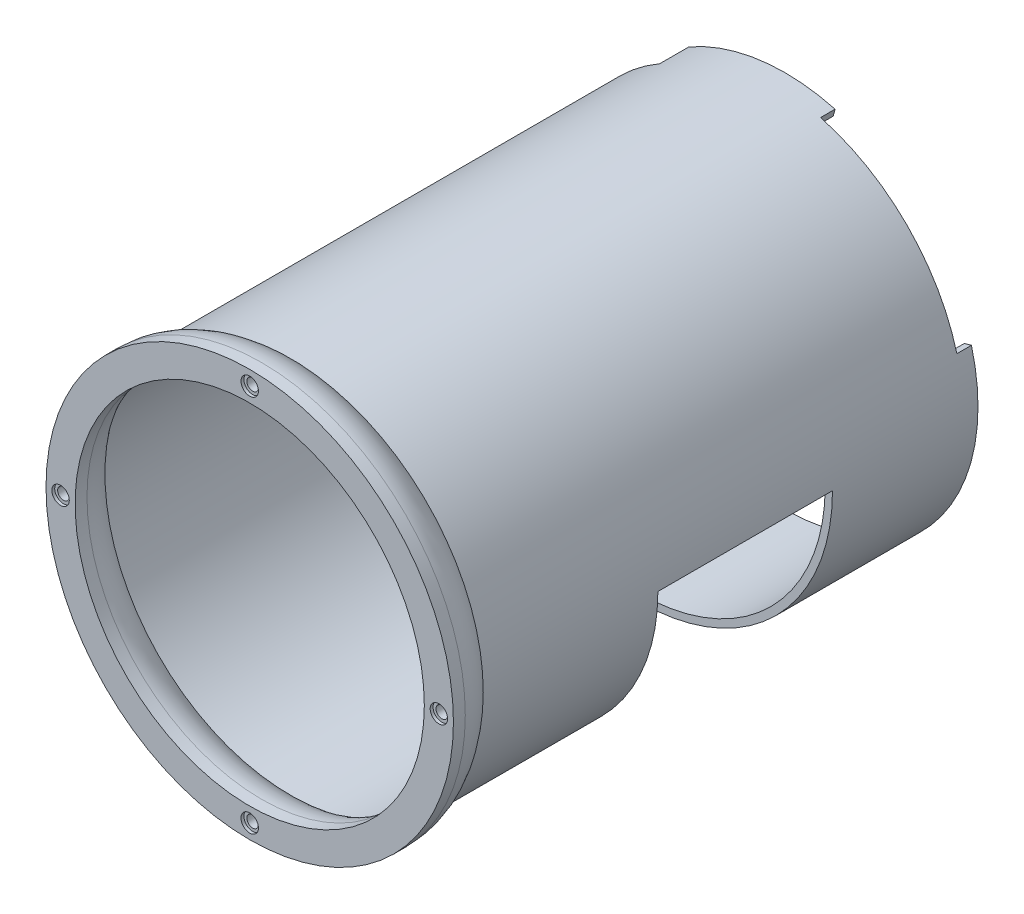
ISO-10303-21;
HEADER;
FILE_DESCRIPTION(('STEP AP214'),'2;1');
FILE_NAME('part.step','',(''),(''),'','','');
FILE_SCHEMA(('AUTOMOTIVE_DESIGN { 1 0 10303 214 1 1 1 1 }'));
ENDSEC;
DATA;
#1=APPLICATION_CONTEXT('core data for automotive mechanical design processes');
#2=APPLICATION_PROTOCOL_DEFINITION('international standard','automotive_design',2000,#1);
#3=PRODUCT_CONTEXT('',#1,'mechanical');
#4=PRODUCT('Part','Part','',(#3));
#5=PRODUCT_RELATED_PRODUCT_CATEGORY('part','',(#4));
#6=PRODUCT_DEFINITION_FORMATION('','',#4);
#7=PRODUCT_DEFINITION_CONTEXT('part definition',#1,'design');
#8=PRODUCT_DEFINITION('design','',#6,#7);
#9=PRODUCT_DEFINITION_SHAPE('','',#8);
#10=(LENGTH_UNIT() NAMED_UNIT(*) SI_UNIT(.MILLI.,.METRE.));
#11=(NAMED_UNIT(*) PLANE_ANGLE_UNIT() SI_UNIT($,.RADIAN.));
#12=(NAMED_UNIT(*) SI_UNIT($,.STERADIAN.) SOLID_ANGLE_UNIT());
#13=UNCERTAINTY_MEASURE_WITH_UNIT(LENGTH_MEASURE(1.E-05),#10,'distance_accuracy_value','');
#14=(GEOMETRIC_REPRESENTATION_CONTEXT(3) GLOBAL_UNCERTAINTY_ASSIGNED_CONTEXT((#13)) GLOBAL_UNIT_ASSIGNED_CONTEXT((#10,
#11,#12)) REPRESENTATION_CONTEXT('',''));
#15=CARTESIAN_POINT('',(0.,0.,0.));
#16=DIRECTION('',(0.,0.,1.));
#17=DIRECTION('',(1.,0.,0.));
#18=AXIS2_PLACEMENT_3D('',#15,#16,#17);
#19=CARTESIAN_POINT('',(0.,0.,-184.));
#20=DIRECTION('',(0.,0.,1.));
#21=DIRECTION('',(1.,0.,0.));
#22=AXIS2_PLACEMENT_3D('',#19,#20,#21);
#23=CYLINDRICAL_SURFACE('',#22,66.25);
#24=CARTESIAN_POINT('',(0.,0.,-74.));
#25=DIRECTION('',(0.,0.,1.));
#26=DIRECTION('',(1.,0.,0.));
#27=AXIS2_PLACEMENT_3D('',#24,#25,#26);
#28=CIRCLE('',#27,66.25);
#29=CARTESIAN_POINT('',(66.25,0.,-74.));
#30=VERTEX_POINT('',#29);
#31=CARTESIAN_POINT('',(0.,-66.25,-74.));
#32=VERTEX_POINT('',#31);
#33=EDGE_CURVE('E307',#30,#32,#28,.F.);
#34=ORIENTED_EDGE('',*,*,#33,.F.);
#35=DIRECTION('',(0.,0.,1.));
#36=VECTOR('',#35,1.);
#37=CARTESIAN_POINT('',(66.25,0.,-184.));
#38=LINE('',#37,#36);
#39=CARTESIAN_POINT('',(66.25,0.,-134.));
#40=VERTEX_POINT('',#39);
#41=EDGE_CURVE('E156',#30,#40,#38,.F.);
#42=ORIENTED_EDGE('',*,*,#41,.T.);
#43=CARTESIAN_POINT('',(0.,0.,-134.));
#44=DIRECTION('',(0.,0.,1.));
#45=DIRECTION('',(1.,0.,0.));
#46=AXIS2_PLACEMENT_3D('',#43,#44,#45);
#47=CIRCLE('',#46,66.25);
#48=CARTESIAN_POINT('',(0.,-66.25,-134.));
#49=VERTEX_POINT('',#48);
#50=EDGE_CURVE('E302',#40,#49,#47,.F.);
#51=ORIENTED_EDGE('',*,*,#50,.T.);
#52=DIRECTION('',(0.,0.,1.));
#53=VECTOR('',#52,1.);
#54=CARTESIAN_POINT('',(0.,-66.25,-184.));
#55=LINE('',#54,#53);
#56=EDGE_CURVE('E163',#49,#32,#55,.T.);
#57=ORIENTED_EDGE('',*,*,#56,.T.);
#58=EDGE_LOOP('',(#34,#42,#51,#57));
#59=FACE_BOUND('',#58,.T.);
#60=CARTESIAN_POINT('',(0.,0.,-14.));
#61=DIRECTION('',(0.,0.,1.));
#62=DIRECTION('',(1.,0.,0.));
#63=AXIS2_PLACEMENT_3D('',#60,#61,#62);
#64=CIRCLE('',#63,66.25);
#65=CARTESIAN_POINT('',(66.25,0.,-14.));
#66=VERTEX_POINT('',#65);
#67=EDGE_CURVE('E158',#66,#66,#64,.T.);
#68=ORIENTED_EDGE('',*,*,#67,.F.);
#69=EDGE_LOOP('',(#68));
#70=FACE_BOUND('',#69,.T.);
#71=CARTESIAN_POINT('',(0.,0.,-184.));
#72=DIRECTION('',(0.,0.,1.));
#73=DIRECTION('',(1.,0.,0.));
#74=AXIS2_PLACEMENT_3D('',#71,#72,#73);
#75=CIRCLE('',#74,66.25);
#76=CARTESIAN_POINT('',(-57.3741830007196,33.1249999999991,-184.));
#77=VERTEX_POINT('',#76);
#78=CARTESIAN_POINT('',(63.9925859916508,17.146761738042,-184.));
#79=VERTEX_POINT('',#78);
#80=EDGE_CURVE('E167',#77,#79,#75,.T.);
#81=ORIENTED_EDGE('',*,*,#80,.T.);
#82=DIRECTION('',(0.,0.,1.));
#83=VECTOR('',#82,1.);
#84=CARTESIAN_POINT('',(63.9925859916508,17.146761738042,-184.));
#85=LINE('',#84,#83);
#86=CARTESIAN_POINT('',(63.9925859916508,17.146761738042,-179.));
#87=VERTEX_POINT('',#86);
#88=EDGE_CURVE('E262',#79,#87,#85,.T.);
#89=ORIENTED_EDGE('',*,*,#88,.T.);
#90=CARTESIAN_POINT('',(0.,0.,-179.));
#91=DIRECTION('',(0.,0.,-1.));
#92=DIRECTION('',(-1.,0.,0.));
#93=AXIS2_PLACEMENT_3D('',#90,#91,#92);
#94=CIRCLE('',#93,66.25);
#95=CARTESIAN_POINT('',(17.146761738042,63.9925859916508,-179.));
#96=VERTEX_POINT('',#95);
#97=EDGE_CURVE('E283',#87,#96,#94,.F.);
#98=ORIENTED_EDGE('',*,*,#97,.T.);
#99=DIRECTION('',(0.,0.,1.));
#100=VECTOR('',#99,1.);
#101=CARTESIAN_POINT('',(17.146761738042,63.9925859916508,-184.));
#102=LINE('',#101,#100);
#103=CARTESIAN_POINT('',(17.146761738042,63.9925859916508,-184.));
#104=VERTEX_POINT('',#103);
#105=EDGE_CURVE('E139',#104,#96,#102,.T.);
#106=ORIENTED_EDGE('',*,*,#105,.F.);
#107=CARTESIAN_POINT('',(-33.1250000000003,57.3741830007189,-184.));
#108=VERTEX_POINT('',#107);
#109=EDGE_CURVE('E147',#104,#108,#75,.T.);
#110=ORIENTED_EDGE('',*,*,#109,.T.);
#111=DIRECTION('',(0.,0.,1.));
#112=VECTOR('',#111,1.);
#113=CARTESIAN_POINT('',(-33.1250000000003,57.3741830007189,-184.));
#114=LINE('',#113,#112);
#115=CARTESIAN_POINT('',(-33.1250000000003,57.3741830007189,-174.));
#116=VERTEX_POINT('',#115);
#117=EDGE_CURVE('E292',#108,#116,#114,.T.);
#118=ORIENTED_EDGE('',*,*,#117,.T.);
#119=CARTESIAN_POINT('',(0.,0.,-174.));
#120=DIRECTION('',(0.,0.,-1.));
#121=DIRECTION('',(-1.,0.,0.));
#122=AXIS2_PLACEMENT_3D('',#119,#120,#121);
#123=CIRCLE('',#122,66.25);
#124=CARTESIAN_POINT('',(-57.3741830007196,33.1249999999991,-174.));
#125=VERTEX_POINT('',#124);
#126=EDGE_CURVE('E289',#116,#125,#123,.F.);
#127=ORIENTED_EDGE('',*,*,#126,.T.);
#128=DIRECTION('',(0.,0.,1.));
#129=VECTOR('',#128,1.);
#130=CARTESIAN_POINT('',(-57.3741830007196,33.1249999999991,-184.));
#131=LINE('',#130,#129);
#132=EDGE_CURVE('E267',#125,#77,#131,.F.);
#133=ORIENTED_EDGE('',*,*,#132,.T.);
#134=EDGE_LOOP('',(#81,#89,#98,#106,#110,#118,#127,#133));
#135=FACE_BOUND('',#134,.T.);
#136=ADVANCED_FACE('F39',(#59,#70,#135),#23,.T.);
#137=CARTESIAN_POINT('',(0.,0.,-184.));
#138=DIRECTION('',(0.,0.,1.));
#139=DIRECTION('',(1.,0.,0.));
#140=AXIS2_PLACEMENT_3D('',#137,#138,#139);
#141=CYLINDRICAL_SURFACE('',#140,63.75);
#142=DIRECTION('',(0.,0.,1.));
#143=VECTOR('',#142,1.);
#144=CARTESIAN_POINT('',(63.75,0.,-184.));
#145=LINE('',#144,#143);
#146=CARTESIAN_POINT('',(63.75,0.,-74.));
#147=VERTEX_POINT('',#146);
#148=CARTESIAN_POINT('',(63.75,0.,-134.));
#149=VERTEX_POINT('',#148);
#150=EDGE_CURVE('E182',#147,#149,#145,.F.);
#151=ORIENTED_EDGE('',*,*,#150,.F.);
#152=CARTESIAN_POINT('',(0.,0.,-74.));
#153=DIRECTION('',(0.,0.,1.));
#154=DIRECTION('',(1.,0.,0.));
#155=AXIS2_PLACEMENT_3D('',#152,#153,#154);
#156=CIRCLE('',#155,63.75);
#157=CARTESIAN_POINT('',(0.,-63.75,-74.));
#158=VERTEX_POINT('',#157);
#159=EDGE_CURVE('E187',#147,#158,#156,.F.);
#160=ORIENTED_EDGE('',*,*,#159,.T.);
#161=DIRECTION('',(0.,0.,1.));
#162=VECTOR('',#161,1.);
#163=CARTESIAN_POINT('',(0.,-63.75,-184.));
#164=LINE('',#163,#162);
#165=CARTESIAN_POINT('',(0.,-63.75,-134.));
#166=VERTEX_POINT('',#165);
#167=EDGE_CURVE('E181',#166,#158,#164,.T.);
#168=ORIENTED_EDGE('',*,*,#167,.F.);
#169=CARTESIAN_POINT('',(0.,0.,-134.));
#170=DIRECTION('',(0.,0.,1.));
#171=DIRECTION('',(1.,0.,0.));
#172=AXIS2_PLACEMENT_3D('',#169,#170,#171);
#173=CIRCLE('',#172,63.75);
#174=EDGE_CURVE('E166',#149,#166,#173,.F.);
#175=ORIENTED_EDGE('',*,*,#174,.F.);
#176=EDGE_LOOP('',(#151,#160,#168,#175));
#177=FACE_BOUND('',#176,.T.);
#178=CARTESIAN_POINT('',(0.,0.,-14.));
#179=DIRECTION('',(0.,0.,1.));
#180=DIRECTION('',(1.,0.,0.));
#181=AXIS2_PLACEMENT_3D('',#178,#179,#180);
#182=CIRCLE('',#181,63.75);
#183=CARTESIAN_POINT('',(63.75,0.,-14.));
#184=VERTEX_POINT('',#183);
#185=EDGE_CURVE('E164',#184,#184,#182,.T.);
#186=ORIENTED_EDGE('',*,*,#185,.T.);
#187=EDGE_LOOP('',(#186));
#188=FACE_BOUND('',#187,.T.);
#189=DIRECTION('',(0.,0.,1.));
#190=VECTOR('',#189,1.);
#191=CARTESIAN_POINT('',(61.5777714259281,16.4997141252857,-184.));
#192=LINE('',#191,#190);
#193=CARTESIAN_POINT('',(61.5777714259281,16.4997141252857,-184.));
#194=VERTEX_POINT('',#193);
#195=CARTESIAN_POINT('',(61.5777714259281,16.4997141252857,-179.));
#196=VERTEX_POINT('',#195);
#197=EDGE_CURVE('E279',#194,#196,#192,.T.);
#198=ORIENTED_EDGE('',*,*,#197,.F.);
#199=CARTESIAN_POINT('',(0.,0.,-184.));
#200=DIRECTION('',(0.,0.,1.));
#201=DIRECTION('',(1.,0.,0.));
#202=AXIS2_PLACEMENT_3D('',#199,#200,#201);
#203=CIRCLE('',#202,63.75);
#204=CARTESIAN_POINT('',(-55.2091194912584,31.8749999999992,-184.));
#205=VERTEX_POINT('',#204);
#206=EDGE_CURVE('E152',#205,#194,#203,.T.);
#207=ORIENTED_EDGE('',*,*,#206,.F.);
#208=DIRECTION('',(0.,0.,1.));
#209=VECTOR('',#208,1.);
#210=CARTESIAN_POINT('',(-55.2091194912584,31.8749999999992,-184.));
#211=LINE('',#210,#209);
#212=CARTESIAN_POINT('',(-55.2091194912584,31.8749999999992,-174.));
#213=VERTEX_POINT('',#212);
#214=EDGE_CURVE('E195',#213,#205,#211,.F.);
#215=ORIENTED_EDGE('',*,*,#214,.F.);
#216=CARTESIAN_POINT('',(0.,0.,-174.));
#217=DIRECTION('',(0.,0.,-1.));
#218=DIRECTION('',(-1.,0.,0.));
#219=AXIS2_PLACEMENT_3D('',#216,#217,#218);
#220=CIRCLE('',#219,63.75);
#221=CARTESIAN_POINT('',(-31.8750000000004,55.2091194912577,-174.));
#222=VERTEX_POINT('',#221);
#223=EDGE_CURVE('E186',#222,#213,#220,.F.);
#224=ORIENTED_EDGE('',*,*,#223,.F.);
#225=DIRECTION('',(0.,0.,1.));
#226=VECTOR('',#225,1.);
#227=CARTESIAN_POINT('',(-31.8750000000004,55.2091194912577,-184.));
#228=LINE('',#227,#226);
#229=CARTESIAN_POINT('',(-31.8750000000004,55.2091194912577,-184.));
#230=VERTEX_POINT('',#229);
#231=EDGE_CURVE('E154',#230,#222,#228,.T.);
#232=ORIENTED_EDGE('',*,*,#231,.F.);
#233=CARTESIAN_POINT('',(16.4997141252857,61.5777714259281,-184.));
#234=VERTEX_POINT('',#233);
#235=EDGE_CURVE('E144',#234,#230,#203,.T.);
#236=ORIENTED_EDGE('',*,*,#235,.F.);
#237=DIRECTION('',(0.,0.,1.));
#238=VECTOR('',#237,1.);
#239=CARTESIAN_POINT('',(16.4997141252857,61.5777714259281,-184.));
#240=LINE('',#239,#238);
#241=CARTESIAN_POINT('',(16.4997141252857,61.5777714259281,-179.));
#242=VERTEX_POINT('',#241);
#243=EDGE_CURVE('E129',#234,#242,#240,.T.);
#244=ORIENTED_EDGE('',*,*,#243,.T.);
#245=CARTESIAN_POINT('',(0.,0.,-179.));
#246=DIRECTION('',(0.,0.,-1.));
#247=DIRECTION('',(-1.,0.,0.));
#248=AXIS2_PLACEMENT_3D('',#245,#246,#247);
#249=CIRCLE('',#248,63.75);
#250=EDGE_CURVE('E150',#196,#242,#249,.F.);
#251=ORIENTED_EDGE('',*,*,#250,.F.);
#252=EDGE_LOOP('',(#198,#207,#215,#224,#232,#236,#244,#251));
#253=FACE_BOUND('',#252,.T.);
#254=ADVANCED_FACE('F155',(#177,#188,#253),#141,.F.);
#255=CARTESIAN_POINT('',(0.,0.,-184.));
#256=DIRECTION('',(0.,0.,1.));
#257=DIRECTION('',(1.,0.,0.));
#258=AXIS2_PLACEMENT_3D('',#255,#256,#257);
#259=PLANE('',#258);
#260=DIRECTION('',(0.258819045102521,0.965925826289068,0.));
#261=VECTOR('',#260,1.);
#262=CARTESIAN_POINT('',(15.5291427061513,57.9555495773442,-184.));
#263=LINE('',#262,#261);
#264=EDGE_CURVE('E133',#234,#104,#263,.T.);
#265=ORIENTED_EDGE('',*,*,#264,.F.);
#266=ORIENTED_EDGE('',*,*,#235,.T.);
#267=DIRECTION('',(-0.499999999999934,0.866025403784477,0.));
#268=VECTOR('',#267,1.);
#269=CARTESIAN_POINT('',(-35.,60.6217782649107,-184.));
#270=LINE('',#269,#268);
#271=EDGE_CURVE('E286',#230,#108,#270,.T.);
#272=ORIENTED_EDGE('',*,*,#271,.T.);
#273=ORIENTED_EDGE('',*,*,#109,.F.);
#274=EDGE_LOOP('',(#265,#266,#272,#273));
#275=FACE_BOUND('',#274,.T.);
#276=ADVANCED_FACE('F145',(#275),#259,.F.);
#277=CARTESIAN_POINT('',(0.,0.,-14.));
#278=DIRECTION('',(0.,0.,1.));
#279=DIRECTION('',(1.,0.,0.));
#280=AXIS2_PLACEMENT_3D('',#277,#278,#279);
#281=CYLINDRICAL_SURFACE('',#280,70.);
#282=CARTESIAN_POINT('',(0.,0.,-4.07843258350779));
#283=DIRECTION('',(0.,0.,-1.));
#284=DIRECTION('',(-1.,0.,0.));
#285=AXIS2_PLACEMENT_3D('',#282,#283,#284);
#286=CIRCLE('',#285,70.);
#287=CARTESIAN_POINT('',(-70.,0.,-4.07843258350779));
#288=VERTEX_POINT('',#287);
#289=EDGE_CURVE('E11',#288,#288,#286,.F.);
#290=ORIENTED_EDGE('',*,*,#289,.T.);
#291=EDGE_LOOP('',(#290));
#292=FACE_BOUND('',#291,.T.);
#293=CARTESIAN_POINT('',(0.,0.,0.));
#294=DIRECTION('',(0.,0.,1.));
#295=DIRECTION('',(1.,0.,0.));
#296=AXIS2_PLACEMENT_3D('',#293,#294,#295);
#297=CIRCLE('',#296,70.);
#298=CARTESIAN_POINT('',(70.,0.,0.));
#299=VERTEX_POINT('',#298);
#300=EDGE_CURVE('E169',#299,#299,#297,.T.);
#301=ORIENTED_EDGE('',*,*,#300,.F.);
#302=EDGE_LOOP('',(#301));
#303=FACE_BOUND('',#302,.T.);
#304=ADVANCED_FACE('F227',(#292,#303),#281,.T.);
#305=CARTESIAN_POINT('',(0.,0.,0.));
#306=DIRECTION('',(0.,0.,1.));
#307=DIRECTION('',(1.,0.,0.));
#308=AXIS2_PLACEMENT_3D('',#305,#306,#307);
#309=PLANE('',#308);
#310=CARTESIAN_POINT('',(-65.,0.,0.));
#311=DIRECTION('',(0.,0.,1.));
#312=DIRECTION('',(1.,0.,0.));
#313=AXIS2_PLACEMENT_3D('',#310,#311,#312);
#314=CIRCLE('',#313,3.);
#315=CARTESIAN_POINT('',(-62.,0.,0.));
#316=VERTEX_POINT('',#315);
#317=EDGE_CURVE('E676',#316,#316,#314,.T.);
#318=ORIENTED_EDGE('',*,*,#317,.F.);
#319=EDGE_LOOP('',(#318));
#320=FACE_BOUND('',#319,.T.);
#321=CARTESIAN_POINT('',(0.,65.,0.));
#322=DIRECTION('',(0.,0.,1.));
#323=DIRECTION('',(1.,0.,0.));
#324=AXIS2_PLACEMENT_3D('',#321,#322,#323);
#325=CIRCLE('',#324,3.00000000000001);
#326=CARTESIAN_POINT('',(3.00000000000001,65.,0.));
#327=VERTEX_POINT('',#326);
#328=EDGE_CURVE('E628',#327,#327,#325,.T.);
#329=ORIENTED_EDGE('',*,*,#328,.F.);
#330=EDGE_LOOP('',(#329));
#331=FACE_BOUND('',#330,.T.);
#332=CARTESIAN_POINT('',(65.,0.,0.));
#333=DIRECTION('',(0.,0.,1.));
#334=DIRECTION('',(1.,0.,0.));
#335=AXIS2_PLACEMENT_3D('',#332,#333,#334);
#336=CIRCLE('',#335,3.);
#337=CARTESIAN_POINT('',(68.,0.,0.));
#338=VERTEX_POINT('',#337);
#339=EDGE_CURVE('E621',#338,#338,#336,.T.);
#340=ORIENTED_EDGE('',*,*,#339,.F.);
#341=EDGE_LOOP('',(#340));
#342=FACE_BOUND('',#341,.T.);
#343=CARTESIAN_POINT('',(0.,-65.,0.));
#344=DIRECTION('',(0.,0.,1.));
#345=DIRECTION('',(1.,0.,0.));
#346=AXIS2_PLACEMENT_3D('',#343,#344,#345);
#347=CIRCLE('',#346,3.);
#348=CARTESIAN_POINT('',(3.,-65.,0.));
#349=VERTEX_POINT('',#348);
#350=EDGE_CURVE('E629',#349,#349,#347,.T.);
#351=ORIENTED_EDGE('',*,*,#350,.F.);
#352=EDGE_LOOP('',(#351));
#353=FACE_BOUND('',#352,.T.);
#354=CARTESIAN_POINT('',(0.,0.,0.));
#355=DIRECTION('',(0.,0.,1.));
#356=DIRECTION('',(1.,0.,0.));
#357=AXIS2_PLACEMENT_3D('',#354,#355,#356);
#358=CIRCLE('',#357,60.);
#359=CARTESIAN_POINT('',(60.,0.,0.));
#360=VERTEX_POINT('',#359);
#361=EDGE_CURVE('E173',#360,#360,#358,.T.);
#362=ORIENTED_EDGE('',*,*,#361,.F.);
#363=EDGE_LOOP('',(#362));
#364=FACE_BOUND('',#363,.T.);
#365=ORIENTED_EDGE('',*,*,#300,.T.);
#366=EDGE_LOOP('',(#365));
#367=FACE_BOUND('',#366,.T.);
#368=ADVANCED_FACE('F241',(#320,#331,#342,#353,#364,#367),#309,.T.);
#369=CARTESIAN_POINT('',(0.,0.,-14.));
#370=DIRECTION('',(0.,0.,1.));
#371=DIRECTION('',(1.,0.,0.));
#372=AXIS2_PLACEMENT_3D('',#369,#370,#371);
#373=CYLINDRICAL_SURFACE('',#372,60.);
#374=CARTESIAN_POINT('',(0.,0.,-4.07843258350779));
#375=DIRECTION('',(0.,0.,-1.));
#376=DIRECTION('',(-1.,0.,0.));
#377=AXIS2_PLACEMENT_3D('',#374,#375,#376);
#378=CIRCLE('',#377,60.);
#379=CARTESIAN_POINT('',(-60.,0.,-4.07843258350779));
#380=VERTEX_POINT('',#379);
#381=EDGE_CURVE('E50',#380,#380,#378,.T.);
#382=ORIENTED_EDGE('',*,*,#381,.T.);
#383=EDGE_LOOP('',(#382));
#384=FACE_BOUND('',#383,.T.);
#385=ORIENTED_EDGE('',*,*,#361,.T.);
#386=EDGE_LOOP('',(#385));
#387=FACE_BOUND('',#386,.T.);
#388=ADVANCED_FACE('F212',(#384,#387),#373,.F.);
#389=ORIENTED_EDGE('',*,*,#206,.T.);
#390=DIRECTION('',(0.965925826289068,0.258819045102521,0.));
#391=VECTOR('',#390,1.);
#392=CARTESIAN_POINT('',(57.9555495773442,15.5291427061513,-184.));
#393=LINE('',#392,#391);
#394=EDGE_CURVE('E149',#194,#79,#393,.T.);
#395=ORIENTED_EDGE('',*,*,#394,.T.);
#396=ORIENTED_EDGE('',*,*,#80,.F.);
#397=DIRECTION('',(0.866025403784446,-0.499999999999988,0.));
#398=VECTOR('',#397,1.);
#399=CARTESIAN_POINT('',(-51.9615242270669,29.9999999999993,-184.));
#400=LINE('',#399,#398);
#401=EDGE_CURVE('E270',#77,#205,#400,.T.);
#402=ORIENTED_EDGE('',*,*,#401,.T.);
#403=EDGE_LOOP('',(#389,#395,#396,#402));
#404=FACE_BOUND('',#403,.T.);
#405=ADVANCED_FACE('F230',(#404),#259,.F.);
#406=CARTESIAN_POINT('',(60.,0.,-74.));
#407=DIRECTION('',(0.,-1.,0.));
#408=DIRECTION('',(0.,0.,-1.));
#409=AXIS2_PLACEMENT_3D('',#406,#407,#408);
#410=PLANE('',#409);
#411=DIRECTION('',(-1.,0.,0.));
#412=VECTOR('',#411,1.);
#413=CARTESIAN_POINT('',(60.,0.,-74.));
#414=LINE('',#413,#412);
#415=EDGE_CURVE('E300',#30,#147,#414,.T.);
#416=ORIENTED_EDGE('',*,*,#415,.T.);
#417=ORIENTED_EDGE('',*,*,#150,.T.);
#418=DIRECTION('',(-1.,0.,0.));
#419=VECTOR('',#418,1.);
#420=CARTESIAN_POINT('',(60.,0.,-134.));
#421=LINE('',#420,#419);
#422=EDGE_CURVE('E298',#40,#149,#421,.T.);
#423=ORIENTED_EDGE('',*,*,#422,.F.);
#424=ORIENTED_EDGE('',*,*,#41,.F.);
#425=EDGE_LOOP('',(#416,#417,#423,#424));
#426=FACE_BOUND('',#425,.T.);
#427=ADVANCED_FACE('F234',(#426),#410,.T.);
#428=CARTESIAN_POINT('',(0.,-70.,-74.));
#429=DIRECTION('',(1.,0.,0.));
#430=DIRECTION('',(0.,0.,-1.));
#431=AXIS2_PLACEMENT_3D('',#428,#429,#430);
#432=PLANE('',#431);
#433=DIRECTION('',(0.,-1.,0.));
#434=VECTOR('',#433,1.);
#435=CARTESIAN_POINT('',(0.,-70.,-134.));
#436=LINE('',#435,#434);
#437=EDGE_CURVE('E301',#166,#49,#436,.T.);
#438=ORIENTED_EDGE('',*,*,#437,.F.);
#439=ORIENTED_EDGE('',*,*,#167,.T.);
#440=DIRECTION('',(0.,-1.,0.));
#441=VECTOR('',#440,1.);
#442=CARTESIAN_POINT('',(0.,-70.,-74.));
#443=LINE('',#442,#441);
#444=EDGE_CURVE('E297',#158,#32,#443,.T.);
#445=ORIENTED_EDGE('',*,*,#444,.T.);
#446=ORIENTED_EDGE('',*,*,#56,.F.);
#447=EDGE_LOOP('',(#438,#439,#445,#446));
#448=FACE_BOUND('',#447,.T.);
#449=ADVANCED_FACE('F314',(#448),#432,.T.);
#450=CARTESIAN_POINT('',(0.,0.,-74.));
#451=DIRECTION('',(0.,0.,1.));
#452=DIRECTION('',(1.,0.,0.));
#453=AXIS2_PLACEMENT_3D('',#450,#451,#452);
#454=PLANE('',#453);
#455=ORIENTED_EDGE('',*,*,#33,.T.);
#456=ORIENTED_EDGE('',*,*,#444,.F.);
#457=ORIENTED_EDGE('',*,*,#159,.F.);
#458=ORIENTED_EDGE('',*,*,#415,.F.);
#459=EDGE_LOOP('',(#455,#456,#457,#458));
#460=FACE_BOUND('',#459,.T.);
#461=ADVANCED_FACE('F316',(#460),#454,.F.);
#462=CARTESIAN_POINT('',(0.,0.,-134.));
#463=DIRECTION('',(0.,0.,1.));
#464=DIRECTION('',(1.,0.,0.));
#465=AXIS2_PLACEMENT_3D('',#462,#463,#464);
#466=PLANE('',#465);
#467=ORIENTED_EDGE('',*,*,#422,.T.);
#468=ORIENTED_EDGE('',*,*,#174,.T.);
#469=ORIENTED_EDGE('',*,*,#437,.T.);
#470=ORIENTED_EDGE('',*,*,#50,.F.);
#471=EDGE_LOOP('',(#467,#468,#469,#470));
#472=FACE_BOUND('',#471,.T.);
#473=ADVANCED_FACE('F323',(#472),#466,.T.);
#474=CARTESIAN_POINT('',(-51.9615242270669,29.9999999999993,-174.));
#475=DIRECTION('',(0.499999999999988,0.866025403784446,0.));
#476=DIRECTION('',(-0.866025403784446,0.499999999999988,0.));
#477=AXIS2_PLACEMENT_3D('',#474,#475,#476);
#478=PLANE('',#477);
#479=DIRECTION('',(0.866025403784446,-0.499999999999988,0.));
#480=VECTOR('',#479,1.);
#481=CARTESIAN_POINT('',(-51.9615242270669,29.9999999999993,-174.));
#482=LINE('',#481,#480);
#483=EDGE_CURVE('E281',#125,#213,#482,.T.);
#484=ORIENTED_EDGE('',*,*,#483,.T.);
#485=ORIENTED_EDGE('',*,*,#214,.T.);
#486=ORIENTED_EDGE('',*,*,#401,.F.);
#487=ORIENTED_EDGE('',*,*,#132,.F.);
#488=EDGE_LOOP('',(#484,#485,#486,#487));
#489=FACE_BOUND('',#488,.T.);
#490=ADVANCED_FACE('F330',(#489),#478,.T.);
#491=CARTESIAN_POINT('',(-35.,60.6217782649107,-174.));
#492=DIRECTION('',(-0.866025403784477,-0.499999999999934,0.));
#493=DIRECTION('',(0.499999999999934,-0.866025403784477,0.));
#494=AXIS2_PLACEMENT_3D('',#491,#492,#493);
#495=PLANE('',#494);
#496=ORIENTED_EDGE('',*,*,#271,.F.);
#497=ORIENTED_EDGE('',*,*,#231,.T.);
#498=DIRECTION('',(-0.499999999999934,0.866025403784477,0.));
#499=VECTOR('',#498,1.);
#500=CARTESIAN_POINT('',(-35.,60.6217782649107,-174.));
#501=LINE('',#500,#499);
#502=EDGE_CURVE('E65',#222,#116,#501,.T.);
#503=ORIENTED_EDGE('',*,*,#502,.T.);
#504=ORIENTED_EDGE('',*,*,#117,.F.);
#505=EDGE_LOOP('',(#496,#497,#503,#504));
#506=FACE_BOUND('',#505,.T.);
#507=ADVANCED_FACE('F334',(#506),#495,.T.);
#508=CARTESIAN_POINT('',(0.,0.,-174.));
#509=DIRECTION('',(0.,0.,-1.));
#510=DIRECTION('',(-1.,0.,0.));
#511=AXIS2_PLACEMENT_3D('',#508,#509,#510);
#512=PLANE('',#511);
#513=ORIENTED_EDGE('',*,*,#502,.F.);
#514=ORIENTED_EDGE('',*,*,#223,.T.);
#515=ORIENTED_EDGE('',*,*,#483,.F.);
#516=ORIENTED_EDGE('',*,*,#126,.F.);
#517=EDGE_LOOP('',(#513,#514,#515,#516));
#518=FACE_BOUND('',#517,.T.);
#519=ADVANCED_FACE('F377',(#518),#512,.T.);
#520=CARTESIAN_POINT('',(0.,0.,-179.));
#521=DIRECTION('',(0.,0.,-1.));
#522=DIRECTION('',(-1.,0.,0.));
#523=AXIS2_PLACEMENT_3D('',#520,#521,#522);
#524=PLANE('',#523);
#525=DIRECTION('',(0.965925826289068,0.258819045102521,0.));
#526=VECTOR('',#525,1.);
#527=CARTESIAN_POINT('',(57.9555495773442,15.5291427061513,-179.));
#528=LINE('',#527,#526);
#529=EDGE_CURVE('E53',#196,#87,#528,.T.);
#530=ORIENTED_EDGE('',*,*,#529,.F.);
#531=ORIENTED_EDGE('',*,*,#250,.T.);
#532=DIRECTION('',(0.258819045102521,0.965925826289068,0.));
#533=VECTOR('',#532,1.);
#534=CARTESIAN_POINT('',(15.5291427061513,57.9555495773442,-179.));
#535=LINE('',#534,#533);
#536=EDGE_CURVE('E134',#242,#96,#535,.T.);
#537=ORIENTED_EDGE('',*,*,#536,.T.);
#538=ORIENTED_EDGE('',*,*,#97,.F.);
#539=EDGE_LOOP('',(#530,#531,#537,#538));
#540=FACE_BOUND('',#539,.T.);
#541=ADVANCED_FACE('F389',(#540),#524,.T.);
#542=CARTESIAN_POINT('',(57.9555495773442,15.5291427061513,-179.));
#543=DIRECTION('',(-0.258819045102521,0.965925826289068,0.));
#544=DIRECTION('',(-0.965925826289068,-0.258819045102521,0.));
#545=AXIS2_PLACEMENT_3D('',#542,#543,#544);
#546=PLANE('',#545);
#547=ORIENTED_EDGE('',*,*,#394,.F.);
#548=ORIENTED_EDGE('',*,*,#197,.T.);
#549=ORIENTED_EDGE('',*,*,#529,.T.);
#550=ORIENTED_EDGE('',*,*,#88,.F.);
#551=EDGE_LOOP('',(#547,#548,#549,#550));
#552=FACE_BOUND('',#551,.T.);
#553=ADVANCED_FACE('F411',(#552),#546,.T.);
#554=CARTESIAN_POINT('',(15.5291427061513,57.9555495773442,-179.));
#555=DIRECTION('',(-0.965925826289068,0.258819045102521,0.));
#556=DIRECTION('',(-0.258819045102521,-0.965925826289068,0.));
#557=AXIS2_PLACEMENT_3D('',#554,#555,#556);
#558=PLANE('',#557);
#559=ORIENTED_EDGE('',*,*,#105,.T.);
#560=ORIENTED_EDGE('',*,*,#536,.F.);
#561=ORIENTED_EDGE('',*,*,#243,.F.);
#562=ORIENTED_EDGE('',*,*,#264,.T.);
#563=EDGE_LOOP('',(#559,#560,#561,#562));
#564=FACE_BOUND('',#563,.T.);
#565=ADVANCED_FACE('F128',(#564),#558,.F.);
#566=CARTESIAN_POINT('',(0.,-65.,-1.));
#567=DIRECTION('',(0.,0.,1.));
#568=DIRECTION('',(1.,0.,0.));
#569=AXIS2_PLACEMENT_3D('',#566,#567,#568);
#570=PLANE('',#569);
#571=CARTESIAN_POINT('',(0.,-65.,-1.));
#572=DIRECTION('',(0.,0.,1.));
#573=DIRECTION('',(1.,0.,0.));
#574=AXIS2_PLACEMENT_3D('',#571,#572,#573);
#575=CIRCLE('',#574,3.);
#576=CARTESIAN_POINT('',(3.,-65.,-1.));
#577=VERTEX_POINT('',#576);
#578=EDGE_CURVE('E636',#577,#577,#575,.T.);
#579=ORIENTED_EDGE('',*,*,#578,.T.);
#580=EDGE_LOOP('',(#579));
#581=FACE_BOUND('',#580,.T.);
#582=CARTESIAN_POINT('',(0.,-65.,-1.));
#583=DIRECTION('',(0.,0.,1.));
#584=DIRECTION('',(1.,0.,0.));
#585=AXIS2_PLACEMENT_3D('',#582,#583,#584);
#586=CIRCLE('',#585,2.);
#587=CARTESIAN_POINT('',(2.,-65.,-1.));
#588=VERTEX_POINT('',#587);
#589=EDGE_CURVE('E193',#588,#588,#586,.F.);
#590=ORIENTED_EDGE('',*,*,#589,.T.);
#591=EDGE_LOOP('',(#590));
#592=FACE_BOUND('',#591,.T.);
#593=ADVANCED_FACE('F427',(#581,#592),#570,.T.);
#594=CARTESIAN_POINT('',(0.,-65.,-1.));
#595=DIRECTION('',(0.,0.,1.));
#596=DIRECTION('',(1.,0.,0.));
#597=AXIS2_PLACEMENT_3D('',#594,#595,#596);
#598=CYLINDRICAL_SURFACE('',#597,3.);
#599=ORIENTED_EDGE('',*,*,#578,.F.);
#600=EDGE_LOOP('',(#599));
#601=FACE_BOUND('',#600,.T.);
#602=ORIENTED_EDGE('',*,*,#350,.T.);
#603=EDGE_LOOP('',(#602));
#604=FACE_BOUND('',#603,.T.);
#605=ADVANCED_FACE('F513',(#601,#604),#598,.F.);
#606=CARTESIAN_POINT('',(-65.,0.,-1.));
#607=DIRECTION('',(0.,0.,1.));
#608=DIRECTION('',(1.,0.,0.));
#609=AXIS2_PLACEMENT_3D('',#606,#607,#608);
#610=PLANE('',#609);
#611=CARTESIAN_POINT('',(-65.,0.,-1.));
#612=DIRECTION('',(0.,0.,1.));
#613=DIRECTION('',(1.,0.,0.));
#614=AXIS2_PLACEMENT_3D('',#611,#612,#613);
#615=CIRCLE('',#614,3.);
#616=CARTESIAN_POINT('',(-62.,0.,-1.));
#617=VERTEX_POINT('',#616);
#618=EDGE_CURVE('E199',#617,#617,#615,.T.);
#619=ORIENTED_EDGE('',*,*,#618,.T.);
#620=EDGE_LOOP('',(#619));
#621=FACE_BOUND('',#620,.T.);
#622=CARTESIAN_POINT('',(-65.,0.,-1.));
#623=DIRECTION('',(0.,0.,1.));
#624=DIRECTION('',(1.,0.,0.));
#625=AXIS2_PLACEMENT_3D('',#622,#623,#624);
#626=CIRCLE('',#625,2.);
#627=CARTESIAN_POINT('',(-63.,0.,-1.));
#628=VERTEX_POINT('',#627);
#629=EDGE_CURVE('E196',#628,#628,#626,.F.);
#630=ORIENTED_EDGE('',*,*,#629,.T.);
#631=EDGE_LOOP('',(#630));
#632=FACE_BOUND('',#631,.T.);
#633=ADVANCED_FACE('F522',(#621,#632),#610,.T.);
#634=CARTESIAN_POINT('',(-65.,0.,-1.));
#635=DIRECTION('',(0.,0.,1.));
#636=DIRECTION('',(1.,0.,0.));
#637=AXIS2_PLACEMENT_3D('',#634,#635,#636);
#638=CYLINDRICAL_SURFACE('',#637,3.);
#639=ORIENTED_EDGE('',*,*,#618,.F.);
#640=EDGE_LOOP('',(#639));
#641=FACE_BOUND('',#640,.T.);
#642=ORIENTED_EDGE('',*,*,#317,.T.);
#643=EDGE_LOOP('',(#642));
#644=FACE_BOUND('',#643,.T.);
#645=ADVANCED_FACE('F533',(#641,#644),#638,.F.);
#646=CARTESIAN_POINT('',(0.,65.,-1.));
#647=DIRECTION('',(0.,0.,1.));
#648=DIRECTION('',(1.,0.,0.));
#649=AXIS2_PLACEMENT_3D('',#646,#647,#648);
#650=PLANE('',#649);
#651=CARTESIAN_POINT('',(0.,65.,-1.));
#652=DIRECTION('',(0.,0.,1.));
#653=DIRECTION('',(1.,0.,0.));
#654=AXIS2_PLACEMENT_3D('',#651,#652,#653);
#655=CIRCLE('',#654,3.00000000000001);
#656=CARTESIAN_POINT('',(3.00000000000001,65.,-1.));
#657=VERTEX_POINT('',#656);
#658=EDGE_CURVE('E622',#657,#657,#655,.T.);
#659=ORIENTED_EDGE('',*,*,#658,.T.);
#660=EDGE_LOOP('',(#659));
#661=FACE_BOUND('',#660,.T.);
#662=CARTESIAN_POINT('',(0.,65.,-1.));
#663=DIRECTION('',(0.,0.,1.));
#664=DIRECTION('',(1.,0.,0.));
#665=AXIS2_PLACEMENT_3D('',#662,#663,#664);
#666=CIRCLE('',#665,2.);
#667=CARTESIAN_POINT('',(2.,65.,-1.));
#668=VERTEX_POINT('',#667);
#669=EDGE_CURVE('E202',#668,#668,#666,.F.);
#670=ORIENTED_EDGE('',*,*,#669,.T.);
#671=EDGE_LOOP('',(#670));
#672=FACE_BOUND('',#671,.T.);
#673=ADVANCED_FACE('F542',(#661,#672),#650,.T.);
#674=CARTESIAN_POINT('',(0.,65.,-1.));
#675=DIRECTION('',(0.,0.,1.));
#676=DIRECTION('',(1.,0.,0.));
#677=AXIS2_PLACEMENT_3D('',#674,#675,#676);
#678=CYLINDRICAL_SURFACE('',#677,3.00000000000001);
#679=ORIENTED_EDGE('',*,*,#658,.F.);
#680=EDGE_LOOP('',(#679));
#681=FACE_BOUND('',#680,.T.);
#682=ORIENTED_EDGE('',*,*,#328,.T.);
#683=EDGE_LOOP('',(#682));
#684=FACE_BOUND('',#683,.T.);
#685=ADVANCED_FACE('F554',(#681,#684),#678,.F.);
#686=CARTESIAN_POINT('',(65.,0.,-1.));
#687=DIRECTION('',(0.,0.,1.));
#688=DIRECTION('',(1.,0.,0.));
#689=AXIS2_PLACEMENT_3D('',#686,#687,#688);
#690=PLANE('',#689);
#691=CARTESIAN_POINT('',(65.,0.,-1.));
#692=DIRECTION('',(0.,0.,1.));
#693=DIRECTION('',(1.,0.,0.));
#694=AXIS2_PLACEMENT_3D('',#691,#692,#693);
#695=CIRCLE('',#694,3.);
#696=CARTESIAN_POINT('',(68.,0.,-1.));
#697=VERTEX_POINT('',#696);
#698=EDGE_CURVE('E619',#697,#697,#695,.T.);
#699=ORIENTED_EDGE('',*,*,#698,.T.);
#700=EDGE_LOOP('',(#699));
#701=FACE_BOUND('',#700,.T.);
#702=CARTESIAN_POINT('',(65.,0.,-1.));
#703=DIRECTION('',(0.,0.,1.));
#704=DIRECTION('',(1.,0.,0.));
#705=AXIS2_PLACEMENT_3D('',#702,#703,#704);
#706=CIRCLE('',#705,2.);
#707=CARTESIAN_POINT('',(67.,0.,-1.));
#708=VERTEX_POINT('',#707);
#709=EDGE_CURVE('E205',#708,#708,#706,.F.);
#710=ORIENTED_EDGE('',*,*,#709,.T.);
#711=EDGE_LOOP('',(#710));
#712=FACE_BOUND('',#711,.T.);
#713=ADVANCED_FACE('F564',(#701,#712),#690,.T.);
#714=CARTESIAN_POINT('',(65.,0.,-1.));
#715=DIRECTION('',(0.,0.,1.));
#716=DIRECTION('',(1.,0.,0.));
#717=AXIS2_PLACEMENT_3D('',#714,#715,#716);
#718=CYLINDRICAL_SURFACE('',#717,3.);
#719=ORIENTED_EDGE('',*,*,#698,.F.);
#720=EDGE_LOOP('',(#719));
#721=FACE_BOUND('',#720,.T.);
#722=ORIENTED_EDGE('',*,*,#339,.T.);
#723=EDGE_LOOP('',(#722));
#724=FACE_BOUND('',#723,.T.);
#725=ADVANCED_FACE('F474',(#721,#724),#718,.F.);
#726=CARTESIAN_POINT('',(0.,-65.,-7.));
#727=DIRECTION('',(0.,0.,1.));
#728=DIRECTION('',(1.,0.,0.));
#729=AXIS2_PLACEMENT_3D('',#726,#727,#728);
#730=PLANE('',#729);
#731=CARTESIAN_POINT('',(0.,-65.,-7.));
#732=DIRECTION('',(0.,0.,1.));
#733=DIRECTION('',(1.,0.,0.));
#734=AXIS2_PLACEMENT_3D('',#731,#732,#733);
#735=CIRCLE('',#734,2.);
#736=CARTESIAN_POINT('',(2.,-65.,-7.));
#737=VERTEX_POINT('',#736);
#738=EDGE_CURVE('E638',#737,#737,#735,.T.);
#739=ORIENTED_EDGE('',*,*,#738,.T.);
#740=EDGE_LOOP('',(#739));
#741=FACE_BOUND('',#740,.T.);
#742=ADVANCED_FACE('F469',(#741),#730,.T.);
#743=CARTESIAN_POINT('',(0.,-65.,-7.));
#744=DIRECTION('',(0.,0.,1.));
#745=DIRECTION('',(1.,0.,0.));
#746=AXIS2_PLACEMENT_3D('',#743,#744,#745);
#747=CYLINDRICAL_SURFACE('',#746,2.);
#748=ORIENTED_EDGE('',*,*,#738,.F.);
#749=EDGE_LOOP('',(#748));
#750=FACE_BOUND('',#749,.T.);
#751=ORIENTED_EDGE('',*,*,#589,.F.);
#752=EDGE_LOOP('',(#751));
#753=FACE_BOUND('',#752,.T.);
#754=ADVANCED_FACE('F462',(#750,#753),#747,.F.);
#755=CARTESIAN_POINT('',(-65.,0.,-7.));
#756=DIRECTION('',(0.,0.,1.));
#757=DIRECTION('',(1.,0.,0.));
#758=AXIS2_PLACEMENT_3D('',#755,#756,#757);
#759=PLANE('',#758);
#760=CARTESIAN_POINT('',(-65.,0.,-7.));
#761=DIRECTION('',(0.,0.,1.));
#762=DIRECTION('',(1.,0.,0.));
#763=AXIS2_PLACEMENT_3D('',#760,#761,#762);
#764=CIRCLE('',#763,2.);
#765=CARTESIAN_POINT('',(-63.,0.,-7.));
#766=VERTEX_POINT('',#765);
#767=EDGE_CURVE('E645',#766,#766,#764,.T.);
#768=ORIENTED_EDGE('',*,*,#767,.T.);
#769=EDGE_LOOP('',(#768));
#770=FACE_BOUND('',#769,.T.);
#771=ADVANCED_FACE('F456',(#770),#759,.T.);
#772=CARTESIAN_POINT('',(-65.,0.,-7.));
#773=DIRECTION('',(0.,0.,1.));
#774=DIRECTION('',(1.,0.,0.));
#775=AXIS2_PLACEMENT_3D('',#772,#773,#774);
#776=CYLINDRICAL_SURFACE('',#775,2.);
#777=ORIENTED_EDGE('',*,*,#767,.F.);
#778=EDGE_LOOP('',(#777));
#779=FACE_BOUND('',#778,.T.);
#780=ORIENTED_EDGE('',*,*,#629,.F.);
#781=EDGE_LOOP('',(#780));
#782=FACE_BOUND('',#781,.T.);
#783=ADVANCED_FACE('F452',(#779,#782),#776,.F.);
#784=CARTESIAN_POINT('',(0.,65.,-7.));
#785=DIRECTION('',(0.,0.,1.));
#786=DIRECTION('',(1.,0.,0.));
#787=AXIS2_PLACEMENT_3D('',#784,#785,#786);
#788=PLANE('',#787);
#789=CARTESIAN_POINT('',(0.,65.,-7.));
#790=DIRECTION('',(0.,0.,1.));
#791=DIRECTION('',(1.,0.,0.));
#792=AXIS2_PLACEMENT_3D('',#789,#790,#791);
#793=CIRCLE('',#792,2.);
#794=CARTESIAN_POINT('',(2.,65.,-7.));
#795=VERTEX_POINT('',#794);
#796=EDGE_CURVE('E643',#795,#795,#793,.T.);
#797=ORIENTED_EDGE('',*,*,#796,.T.);
#798=EDGE_LOOP('',(#797));
#799=FACE_BOUND('',#798,.T.);
#800=ADVANCED_FACE('F450',(#799),#788,.T.);
#801=CARTESIAN_POINT('',(0.,65.,-7.));
#802=DIRECTION('',(0.,0.,1.));
#803=DIRECTION('',(1.,0.,0.));
#804=AXIS2_PLACEMENT_3D('',#801,#802,#803);
#805=CYLINDRICAL_SURFACE('',#804,2.);
#806=ORIENTED_EDGE('',*,*,#796,.F.);
#807=EDGE_LOOP('',(#806));
#808=FACE_BOUND('',#807,.T.);
#809=ORIENTED_EDGE('',*,*,#669,.F.);
#810=EDGE_LOOP('',(#809));
#811=FACE_BOUND('',#810,.T.);
#812=ADVANCED_FACE('F439',(#808,#811),#805,.F.);
#813=CARTESIAN_POINT('',(65.,0.,-7.));
#814=DIRECTION('',(0.,0.,1.));
#815=DIRECTION('',(1.,0.,0.));
#816=AXIS2_PLACEMENT_3D('',#813,#814,#815);
#817=PLANE('',#816);
#818=CARTESIAN_POINT('',(65.,0.,-7.));
#819=DIRECTION('',(0.,0.,1.));
#820=DIRECTION('',(1.,0.,0.));
#821=AXIS2_PLACEMENT_3D('',#818,#819,#820);
#822=CIRCLE('',#821,2.);
#823=CARTESIAN_POINT('',(67.,0.,-7.));
#824=VERTEX_POINT('',#823);
#825=EDGE_CURVE('E210',#824,#824,#822,.T.);
#826=ORIENTED_EDGE('',*,*,#825,.T.);
#827=EDGE_LOOP('',(#826));
#828=FACE_BOUND('',#827,.T.);
#829=ADVANCED_FACE('F436',(#828),#817,.T.);
#830=CARTESIAN_POINT('',(65.,0.,-7.));
#831=DIRECTION('',(0.,0.,1.));
#832=DIRECTION('',(1.,0.,0.));
#833=AXIS2_PLACEMENT_3D('',#830,#831,#832);
#834=CYLINDRICAL_SURFACE('',#833,2.);
#835=ORIENTED_EDGE('',*,*,#825,.F.);
#836=EDGE_LOOP('',(#835));
#837=FACE_BOUND('',#836,.T.);
#838=ORIENTED_EDGE('',*,*,#709,.F.);
#839=EDGE_LOOP('',(#838));
#840=FACE_BOUND('',#839,.T.);
#841=ADVANCED_FACE('F220',(#837,#840),#834,.F.);
#842=CARTESIAN_POINT('',(0.,0.,-4.07843258350779));
#843=DIRECTION('',(0.,0.,-1.));
#844=DIRECTION('',(-1.,0.,0.));
#845=AXIS2_PLACEMENT_3D('',#842,#843,#844);
#846=TOROIDAL_SURFACE('',#845,75.,15.);
#847=ORIENTED_EDGE('',*,*,#381,.F.);
#848=EDGE_LOOP('',(#847));
#849=FACE_BOUND('',#848,.T.);
#850=ORIENTED_EDGE('',*,*,#185,.F.);
#851=EDGE_LOOP('',(#850));
#852=FACE_BOUND('',#851,.T.);
#853=ADVANCED_FACE('F211',(#849,#852),#846,.T.);
#854=CARTESIAN_POINT('',(0.,0.,-4.07843258350779));
#855=DIRECTION('',(0.,0.,-1.));
#856=DIRECTION('',(-1.,0.,0.));
#857=AXIS2_PLACEMENT_3D('',#854,#855,#856);
#858=TOROIDAL_SURFACE('',#857,55.,15.);
#859=ORIENTED_EDGE('',*,*,#67,.T.);
#860=EDGE_LOOP('',(#859));
#861=FACE_BOUND('',#860,.T.);
#862=ORIENTED_EDGE('',*,*,#289,.F.);
#863=EDGE_LOOP('',(#862));
#864=FACE_BOUND('',#863,.T.);
#865=ADVANCED_FACE('F41',(#861,#864),#858,.T.);
#866=CLOSED_SHELL('',(#136,#254,#276,#304,#368,#388,#405,#427,#449,#461,#473,#490,#507,#519,
#541,#553,#565,#593,#605,#633,#645,#673,#685,#713,#725,#742,#754,#771,#783,#800,#812,#829,#841,
#853,#865));
#867=MANIFOLD_SOLID_BREP('B2',#866);
#868=ADVANCED_BREP_SHAPE_REPRESENTATION('',(#18,#867),#14);
#869=SHAPE_DEFINITION_REPRESENTATION(#9,#868);
ENDSEC;
END-ISO-10303-21;
